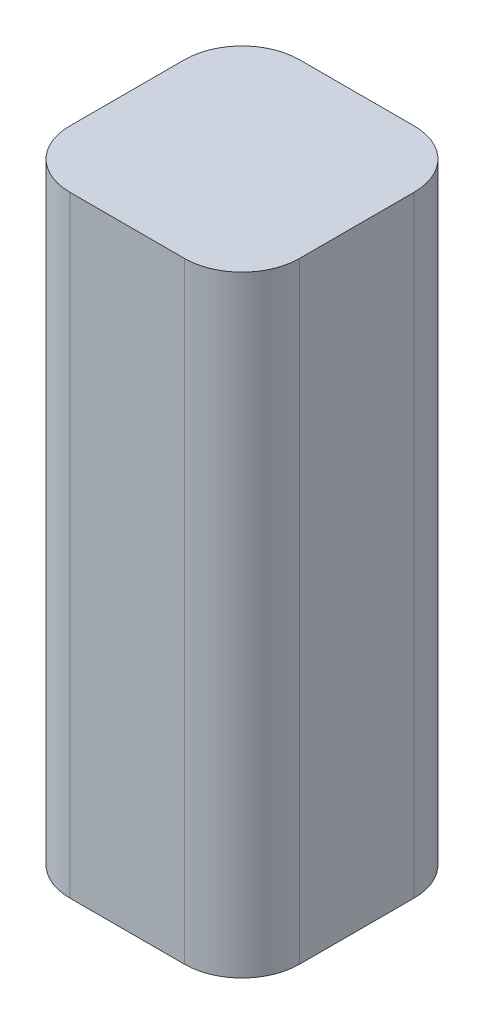
ISO-10303-21;
HEADER;
FILE_DESCRIPTION(('STEP AP214'),'2;1');
FILE_NAME('part.step','',(''),(''),'','','');
FILE_SCHEMA(('AUTOMOTIVE_DESIGN { 1 0 10303 214 1 1 1 1 }'));
ENDSEC;
DATA;
#1=APPLICATION_CONTEXT('core data for automotive mechanical design processes');
#2=APPLICATION_PROTOCOL_DEFINITION('international standard','automotive_design',2000,#1);
#3=PRODUCT_CONTEXT('',#1,'mechanical');
#4=PRODUCT('Part','Part','',(#3));
#5=PRODUCT_RELATED_PRODUCT_CATEGORY('part','',(#4));
#6=PRODUCT_DEFINITION_FORMATION('','',#4);
#7=PRODUCT_DEFINITION_CONTEXT('part definition',#1,'design');
#8=PRODUCT_DEFINITION('design','',#6,#7);
#9=PRODUCT_DEFINITION_SHAPE('','',#8);
#10=(LENGTH_UNIT() NAMED_UNIT(*) SI_UNIT(.MILLI.,.METRE.));
#11=(NAMED_UNIT(*) PLANE_ANGLE_UNIT() SI_UNIT($,.RADIAN.));
#12=(NAMED_UNIT(*) SI_UNIT($,.STERADIAN.) SOLID_ANGLE_UNIT());
#13=UNCERTAINTY_MEASURE_WITH_UNIT(LENGTH_MEASURE(1.E-05),#10,'distance_accuracy_value','');
#14=(GEOMETRIC_REPRESENTATION_CONTEXT(3) GLOBAL_UNCERTAINTY_ASSIGNED_CONTEXT((#13)) GLOBAL_UNIT_ASSIGNED_CONTEXT((#10,
#11,#12)) REPRESENTATION_CONTEXT('',''));
#15=CARTESIAN_POINT('',(0.,0.,0.));
#16=DIRECTION('',(0.,0.,1.));
#17=DIRECTION('',(1.,0.,0.));
#18=AXIS2_PLACEMENT_3D('',#15,#16,#17);
#19=CARTESIAN_POINT('',(0.,0.,0.));
#20=DIRECTION('',(0.,1.,0.));
#21=DIRECTION('',(0.,0.,1.));
#22=AXIS2_PLACEMENT_3D('',#19,#20,#21);
#23=PLANE('',#22);
#24=DIRECTION('',(-1.,0.,0.));
#25=VECTOR('',#24,1.);
#26=CARTESIAN_POINT('',(-4.,0.,-4.));
#27=LINE('',#26,#25);
#28=CARTESIAN_POINT('',(2.,0.,-4.));
#29=VERTEX_POINT('',#28);
#30=CARTESIAN_POINT('',(-2.,0.,-4.));
#31=VERTEX_POINT('',#30);
#32=EDGE_CURVE('E168',#29,#31,#27,.T.);
#33=ORIENTED_EDGE('',*,*,#32,.F.);
#34=CARTESIAN_POINT('',(2.,0.,-2.));
#35=DIRECTION('',(0.,1.,0.));
#36=DIRECTION('',(0.,0.,1.));
#37=AXIS2_PLACEMENT_3D('',#34,#35,#36);
#38=CIRCLE('',#37,2.);
#39=CARTESIAN_POINT('',(4.,0.,-2.));
#40=VERTEX_POINT('',#39);
#41=EDGE_CURVE('E194',#29,#40,#38,.F.);
#42=ORIENTED_EDGE('',*,*,#41,.T.);
#43=DIRECTION('',(0.,0.,-1.));
#44=VECTOR('',#43,1.);
#45=CARTESIAN_POINT('',(4.,0.,-4.));
#46=LINE('',#45,#44);
#47=CARTESIAN_POINT('',(4.,0.,2.));
#48=VERTEX_POINT('',#47);
#49=EDGE_CURVE('E165',#48,#40,#46,.T.);
#50=ORIENTED_EDGE('',*,*,#49,.F.);
#51=CARTESIAN_POINT('',(2.,0.,2.));
#52=DIRECTION('',(0.,1.,0.));
#53=DIRECTION('',(0.,0.,1.));
#54=AXIS2_PLACEMENT_3D('',#51,#52,#53);
#55=CIRCLE('',#54,2.);
#56=CARTESIAN_POINT('',(2.,0.,4.));
#57=VERTEX_POINT('',#56);
#58=EDGE_CURVE('E192',#48,#57,#55,.F.);
#59=ORIENTED_EDGE('',*,*,#58,.T.);
#60=DIRECTION('',(1.,0.,0.));
#61=VECTOR('',#60,1.);
#62=CARTESIAN_POINT('',(-4.,0.,4.));
#63=LINE('',#62,#61);
#64=CARTESIAN_POINT('',(-2.,0.,4.));
#65=VERTEX_POINT('',#64);
#66=EDGE_CURVE('E174',#65,#57,#63,.T.);
#67=ORIENTED_EDGE('',*,*,#66,.F.);
#68=CARTESIAN_POINT('',(-2.,0.,2.));
#69=DIRECTION('',(0.,1.,0.));
#70=DIRECTION('',(0.,0.,1.));
#71=AXIS2_PLACEMENT_3D('',#68,#69,#70);
#72=CIRCLE('',#71,2.);
#73=CARTESIAN_POINT('',(-4.,0.,2.));
#74=VERTEX_POINT('',#73);
#75=EDGE_CURVE('E188',#65,#74,#72,.F.);
#76=ORIENTED_EDGE('',*,*,#75,.T.);
#77=DIRECTION('',(0.,0.,1.));
#78=VECTOR('',#77,1.);
#79=CARTESIAN_POINT('',(-4.,0.,-4.));
#80=LINE('',#79,#78);
#81=CARTESIAN_POINT('',(-4.,0.,-2.));
#82=VERTEX_POINT('',#81);
#83=EDGE_CURVE('E171',#82,#74,#80,.T.);
#84=ORIENTED_EDGE('',*,*,#83,.F.);
#85=CARTESIAN_POINT('',(-2.,0.,-2.));
#86=DIRECTION('',(0.,1.,0.));
#87=DIRECTION('',(0.,0.,1.));
#88=AXIS2_PLACEMENT_3D('',#85,#86,#87);
#89=CIRCLE('',#88,2.);
#90=EDGE_CURVE('E190',#82,#31,#89,.F.);
#91=ORIENTED_EDGE('',*,*,#90,.T.);
#92=EDGE_LOOP('',(#33,#42,#50,#59,#67,#76,#84,#91));
#93=FACE_BOUND('',#92,.T.);
#94=CARTESIAN_POINT('',(0.,0.,0.));
#95=DIRECTION('',(0.,1.,0.));
#96=DIRECTION('',(0.,0.,1.));
#97=AXIS2_PLACEMENT_3D('',#94,#95,#96);
#98=CIRCLE('',#97,3.05);
#99=CARTESIAN_POINT('',(0.,0.,3.05));
#100=VERTEX_POINT('',#99);
#101=EDGE_CURVE('E162',#100,#100,#98,.T.);
#102=ORIENTED_EDGE('',*,*,#101,.T.);
#103=EDGE_LOOP('',(#102));
#104=FACE_BOUND('',#103,.T.);
#105=ADVANCED_FACE('F33',(#93,#104),#23,.F.);
#106=CARTESIAN_POINT('',(4.,8.8,-4.));
#107=DIRECTION('',(-1.,0.,0.));
#108=DIRECTION('',(0.,0.,1.));
#109=AXIS2_PLACEMENT_3D('',#106,#107,#108);
#110=PLANE('',#109);
#111=ORIENTED_EDGE('',*,*,#49,.T.);
#112=DIRECTION('',(0.,-1.,0.));
#113=VECTOR('',#112,1.);
#114=CARTESIAN_POINT('',(4.,8.8,-2.));
#115=LINE('',#114,#113);
#116=CARTESIAN_POINT('',(4.,21.3,-2.));
#117=VERTEX_POINT('',#116);
#118=EDGE_CURVE('E199',#40,#117,#115,.F.);
#119=ORIENTED_EDGE('',*,*,#118,.T.);
#120=DIRECTION('',(0.,0.,-1.));
#121=VECTOR('',#120,1.);
#122=CARTESIAN_POINT('',(4.,21.3,4.));
#123=LINE('',#122,#121);
#124=CARTESIAN_POINT('',(4.,21.3,2.));
#125=VERTEX_POINT('',#124);
#126=EDGE_CURVE('E239',#125,#117,#123,.T.);
#127=ORIENTED_EDGE('',*,*,#126,.F.);
#128=DIRECTION('',(0.,-1.,0.));
#129=VECTOR('',#128,1.);
#130=CARTESIAN_POINT('',(4.,8.8,2.));
#131=LINE('',#130,#129);
#132=EDGE_CURVE('E196',#125,#48,#131,.T.);
#133=ORIENTED_EDGE('',*,*,#132,.T.);
#134=EDGE_LOOP('',(#111,#119,#127,#133));
#135=FACE_BOUND('',#134,.T.);
#136=ADVANCED_FACE('F237',(#135),#110,.F.);
#137=CARTESIAN_POINT('',(-4.,8.8,-4.));
#138=DIRECTION('',(0.,0.,1.));
#139=DIRECTION('',(1.,0.,0.));
#140=AXIS2_PLACEMENT_3D('',#137,#138,#139);
#141=PLANE('',#140);
#142=DIRECTION('',(-1.,0.,0.));
#143=VECTOR('',#142,1.);
#144=CARTESIAN_POINT('',(-4.,21.3,-4.));
#145=LINE('',#144,#143);
#146=CARTESIAN_POINT('',(2.,21.3,-4.));
#147=VERTEX_POINT('',#146);
#148=CARTESIAN_POINT('',(-2.,21.3,-4.));
#149=VERTEX_POINT('',#148);
#150=EDGE_CURVE('E222',#147,#149,#145,.T.);
#151=ORIENTED_EDGE('',*,*,#150,.F.);
#152=DIRECTION('',(0.,-1.,0.));
#153=VECTOR('',#152,1.);
#154=CARTESIAN_POINT('',(2.,8.8,-4.));
#155=LINE('',#154,#153);
#156=EDGE_CURVE('E185',#147,#29,#155,.T.);
#157=ORIENTED_EDGE('',*,*,#156,.T.);
#158=ORIENTED_EDGE('',*,*,#32,.T.);
#159=DIRECTION('',(0.,-1.,0.));
#160=VECTOR('',#159,1.);
#161=CARTESIAN_POINT('',(-2.,8.8,-4.));
#162=LINE('',#161,#160);
#163=EDGE_CURVE('E183',#31,#149,#162,.F.);
#164=ORIENTED_EDGE('',*,*,#163,.T.);
#165=EDGE_LOOP('',(#151,#157,#158,#164));
#166=FACE_BOUND('',#165,.T.);
#167=ADVANCED_FACE('F278',(#166),#141,.F.);
#168=CARTESIAN_POINT('',(-4.,8.8,-4.));
#169=DIRECTION('',(1.,0.,0.));
#170=DIRECTION('',(0.,0.,-1.));
#171=AXIS2_PLACEMENT_3D('',#168,#169,#170);
#172=PLANE('',#171);
#173=DIRECTION('',(0.,0.,1.));
#174=VECTOR('',#173,1.);
#175=CARTESIAN_POINT('',(-4.,12.,1.30742598904123));
#176=LINE('',#175,#174);
#177=CARTESIAN_POINT('',(-4.,12.,-1.30742598904123));
#178=VERTEX_POINT('',#177);
#179=CARTESIAN_POINT('',(-4.,12.,1.30742598904123));
#180=VERTEX_POINT('',#179);
#181=EDGE_CURVE('E140',#178,#180,#176,.T.);
#182=ORIENTED_EDGE('',*,*,#181,.F.);
#183=DIRECTION('',(0.,-1.,0.));
#184=VECTOR('',#183,1.);
#185=CARTESIAN_POINT('',(-4.,12.,-1.30742598904123));
#186=LINE('',#185,#184);
#187=CARTESIAN_POINT('',(-4.,12.8,-1.30742598904123));
#188=VERTEX_POINT('',#187);
#189=EDGE_CURVE('E145',#188,#178,#186,.T.);
#190=ORIENTED_EDGE('',*,*,#189,.F.);
#191=DIRECTION('',(0.,0.,-1.));
#192=VECTOR('',#191,1.);
#193=CARTESIAN_POINT('',(-4.,12.8,1.30742598904123));
#194=LINE('',#193,#192);
#195=CARTESIAN_POINT('',(-4.,12.8,1.30742598904123));
#196=VERTEX_POINT('',#195);
#197=EDGE_CURVE('E150',#196,#188,#194,.T.);
#198=ORIENTED_EDGE('',*,*,#197,.F.);
#199=DIRECTION('',(0.,1.,0.));
#200=VECTOR('',#199,1.);
#201=CARTESIAN_POINT('',(-4.,12.,1.30742598904123));
#202=LINE('',#201,#200);
#203=EDGE_CURVE('E129',#180,#196,#202,.T.);
#204=ORIENTED_EDGE('',*,*,#203,.F.);
#205=EDGE_LOOP('',(#182,#190,#198,#204));
#206=FACE_BOUND('',#205,.T.);
#207=DIRECTION('',(0.,0.,1.));
#208=VECTOR('',#207,1.);
#209=CARTESIAN_POINT('',(-4.,21.3,4.));
#210=LINE('',#209,#208);
#211=CARTESIAN_POINT('',(-4.,21.3,-2.));
#212=VERTEX_POINT('',#211);
#213=CARTESIAN_POINT('',(-4.,21.3,2.));
#214=VERTEX_POINT('',#213);
#215=EDGE_CURVE('E213',#212,#214,#210,.T.);
#216=ORIENTED_EDGE('',*,*,#215,.F.);
#217=DIRECTION('',(0.,-1.,0.));
#218=VECTOR('',#217,1.);
#219=CARTESIAN_POINT('',(-4.,8.8,-2.));
#220=LINE('',#219,#218);
#221=EDGE_CURVE('E11',#212,#82,#220,.T.);
#222=ORIENTED_EDGE('',*,*,#221,.T.);
#223=ORIENTED_EDGE('',*,*,#83,.T.);
#224=DIRECTION('',(0.,-1.,0.));
#225=VECTOR('',#224,1.);
#226=CARTESIAN_POINT('',(-4.,8.8,2.));
#227=LINE('',#226,#225);
#228=EDGE_CURVE('E41',#74,#214,#227,.F.);
#229=ORIENTED_EDGE('',*,*,#228,.T.);
#230=EDGE_LOOP('',(#216,#222,#223,#229));
#231=FACE_BOUND('',#230,.T.);
#232=ADVANCED_FACE('F147',(#206,#231),#172,.F.);
#233=CARTESIAN_POINT('',(-4.,8.8,4.));
#234=DIRECTION('',(0.,0.,-1.));
#235=DIRECTION('',(-1.,0.,0.));
#236=AXIS2_PLACEMENT_3D('',#233,#234,#235);
#237=PLANE('',#236);
#238=ORIENTED_EDGE('',*,*,#66,.T.);
#239=DIRECTION('',(0.,-1.,0.));
#240=VECTOR('',#239,1.);
#241=CARTESIAN_POINT('',(2.,8.8,4.));
#242=LINE('',#241,#240);
#243=CARTESIAN_POINT('',(2.,21.3,4.));
#244=VERTEX_POINT('',#243);
#245=EDGE_CURVE('E48',#57,#244,#242,.F.);
#246=ORIENTED_EDGE('',*,*,#245,.T.);
#247=DIRECTION('',(1.,0.,0.));
#248=VECTOR('',#247,1.);
#249=CARTESIAN_POINT('',(-4.,21.3,4.));
#250=LINE('',#249,#248);
#251=CARTESIAN_POINT('',(-2.,21.3,4.));
#252=VERTEX_POINT('',#251);
#253=EDGE_CURVE('E221',#252,#244,#250,.T.);
#254=ORIENTED_EDGE('',*,*,#253,.F.);
#255=DIRECTION('',(0.,-1.,0.));
#256=VECTOR('',#255,1.);
#257=CARTESIAN_POINT('',(-2.,8.8,4.));
#258=LINE('',#257,#256);
#259=EDGE_CURVE('E208',#252,#65,#258,.T.);
#260=ORIENTED_EDGE('',*,*,#259,.T.);
#261=EDGE_LOOP('',(#238,#246,#254,#260));
#262=FACE_BOUND('',#261,.T.);
#263=ADVANCED_FACE('F226',(#262),#237,.F.);
#264=CARTESIAN_POINT('',(0.,8.8,0.));
#265=DIRECTION('',(0.,-1.,0.));
#266=DIRECTION('',(0.,0.,-1.));
#267=AXIS2_PLACEMENT_3D('',#264,#265,#266);
#268=CYLINDRICAL_SURFACE('',#267,3.05);
#269=DIRECTION('',(0.,-1.,0.));
#270=VECTOR('',#269,1.);
#271=CARTESIAN_POINT('',(-2.75556478479087,8.8,-1.30742598904123));
#272=LINE('',#271,#270);
#273=CARTESIAN_POINT('',(-2.75556478479087,12.,-1.30742598904123));
#274=VERTEX_POINT('',#273);
#275=CARTESIAN_POINT('',(-2.75556478479087,12.8,-1.30742598904123));
#276=VERTEX_POINT('',#275);
#277=EDGE_CURVE('E181',#274,#276,#272,.F.);
#278=ORIENTED_EDGE('',*,*,#277,.F.);
#279=CARTESIAN_POINT('',(0.,12.,0.));
#280=DIRECTION('',(0.,-1.,0.));
#281=DIRECTION('',(0.,0.,-1.));
#282=AXIS2_PLACEMENT_3D('',#279,#280,#281);
#283=CIRCLE('',#282,3.05);
#284=CARTESIAN_POINT('',(-2.75556478479087,12.,1.30742598904123));
#285=VERTEX_POINT('',#284);
#286=EDGE_CURVE('E176',#285,#274,#283,.T.);
#287=ORIENTED_EDGE('',*,*,#286,.F.);
#288=DIRECTION('',(0.,-1.,0.));
#289=VECTOR('',#288,1.);
#290=CARTESIAN_POINT('',(-2.75556478479087,8.8,1.30742598904123));
#291=LINE('',#290,#289);
#292=CARTESIAN_POINT('',(-2.75556478479087,12.8,1.30742598904123));
#293=VERTEX_POINT('',#292);
#294=EDGE_CURVE('E132',#293,#285,#291,.T.);
#295=ORIENTED_EDGE('',*,*,#294,.F.);
#296=CARTESIAN_POINT('',(0.,12.8,0.));
#297=DIRECTION('',(0.,1.,0.));
#298=DIRECTION('',(0.,0.,1.));
#299=AXIS2_PLACEMENT_3D('',#296,#297,#298);
#300=CIRCLE('',#299,3.05);
#301=EDGE_CURVE('E179',#276,#293,#300,.T.);
#302=ORIENTED_EDGE('',*,*,#301,.F.);
#303=EDGE_LOOP('',(#278,#287,#295,#302));
#304=FACE_BOUND('',#303,.T.);
#305=ORIENTED_EDGE('',*,*,#101,.F.);
#306=EDGE_LOOP('',(#305));
#307=FACE_BOUND('',#306,.T.);
#308=CARTESIAN_POINT('',(0.,13.3,0.));
#309=DIRECTION('',(0.,-1.,0.));
#310=DIRECTION('',(0.,0.,-1.));
#311=AXIS2_PLACEMENT_3D('',#308,#309,#310);
#312=CIRCLE('',#311,3.05);
#313=CARTESIAN_POINT('',(0.,13.3,-3.05));
#314=VERTEX_POINT('',#313);
#315=EDGE_CURVE('E157',#314,#314,#312,.T.);
#316=ORIENTED_EDGE('',*,*,#315,.F.);
#317=EDGE_LOOP('',(#316));
#318=FACE_BOUND('',#317,.T.);
#319=ADVANCED_FACE('F252',(#304,#307,#318),#268,.F.);
#320=CARTESIAN_POINT('',(2.,12.,-1.30742598904123));
#321=DIRECTION('',(0.,0.,-1.));
#322=DIRECTION('',(-1.,0.,0.));
#323=AXIS2_PLACEMENT_3D('',#320,#321,#322);
#324=PLANE('',#323);
#325=ORIENTED_EDGE('',*,*,#277,.T.);
#326=DIRECTION('',(-1.,0.,0.));
#327=VECTOR('',#326,1.);
#328=CARTESIAN_POINT('',(2.,12.8,-1.30742598904123));
#329=LINE('',#328,#327);
#330=EDGE_CURVE('E155',#276,#188,#329,.T.);
#331=ORIENTED_EDGE('',*,*,#330,.T.);
#332=ORIENTED_EDGE('',*,*,#189,.T.);
#333=DIRECTION('',(-1.,0.,0.));
#334=VECTOR('',#333,1.);
#335=CARTESIAN_POINT('',(2.,12.,-1.30742598904123));
#336=LINE('',#335,#334);
#337=EDGE_CURVE('E136',#274,#178,#336,.T.);
#338=ORIENTED_EDGE('',*,*,#337,.F.);
#339=EDGE_LOOP('',(#325,#331,#332,#338));
#340=FACE_BOUND('',#339,.T.);
#341=ADVANCED_FACE('F245',(#340),#324,.F.);
#342=CARTESIAN_POINT('',(2.,12.8,1.30742598904123));
#343=DIRECTION('',(0.,1.,0.));
#344=DIRECTION('',(0.,0.,1.));
#345=AXIS2_PLACEMENT_3D('',#342,#343,#344);
#346=PLANE('',#345);
#347=ORIENTED_EDGE('',*,*,#301,.T.);
#348=DIRECTION('',(-1.,0.,0.));
#349=VECTOR('',#348,1.);
#350=CARTESIAN_POINT('',(2.,12.8,1.30742598904123));
#351=LINE('',#350,#349);
#352=EDGE_CURVE('E135',#293,#196,#351,.T.);
#353=ORIENTED_EDGE('',*,*,#352,.T.);
#354=ORIENTED_EDGE('',*,*,#197,.T.);
#355=ORIENTED_EDGE('',*,*,#330,.F.);
#356=EDGE_LOOP('',(#347,#353,#354,#355));
#357=FACE_BOUND('',#356,.T.);
#358=ADVANCED_FACE('F250',(#357),#346,.F.);
#359=CARTESIAN_POINT('',(2.,12.,1.30742598904123));
#360=DIRECTION('',(0.,0.,1.));
#361=DIRECTION('',(0.,-1.,0.));
#362=AXIS2_PLACEMENT_3D('',#359,#360,#361);
#363=PLANE('',#362);
#364=ORIENTED_EDGE('',*,*,#294,.T.);
#365=DIRECTION('',(-1.,0.,0.));
#366=VECTOR('',#365,1.);
#367=CARTESIAN_POINT('',(2.,12.,1.30742598904123));
#368=LINE('',#367,#366);
#369=EDGE_CURVE('E124',#285,#180,#368,.T.);
#370=ORIENTED_EDGE('',*,*,#369,.T.);
#371=ORIENTED_EDGE('',*,*,#203,.T.);
#372=ORIENTED_EDGE('',*,*,#352,.F.);
#373=EDGE_LOOP('',(#364,#370,#371,#372));
#374=FACE_BOUND('',#373,.T.);
#375=ADVANCED_FACE('F126',(#374),#363,.F.);
#376=CARTESIAN_POINT('',(2.,12.,1.30742598904123));
#377=DIRECTION('',(0.,-1.,0.));
#378=DIRECTION('',(0.,0.,-1.));
#379=AXIS2_PLACEMENT_3D('',#376,#377,#378);
#380=PLANE('',#379);
#381=ORIENTED_EDGE('',*,*,#286,.T.);
#382=ORIENTED_EDGE('',*,*,#337,.T.);
#383=ORIENTED_EDGE('',*,*,#181,.T.);
#384=ORIENTED_EDGE('',*,*,#369,.F.);
#385=EDGE_LOOP('',(#381,#382,#383,#384));
#386=FACE_BOUND('',#385,.T.);
#387=ADVANCED_FACE('F141',(#386),#380,.F.);
#388=CARTESIAN_POINT('',(0.,21.3,0.));
#389=DIRECTION('',(0.,-1.,0.));
#390=DIRECTION('',(0.,0.,-1.));
#391=AXIS2_PLACEMENT_3D('',#388,#389,#390);
#392=PLANE('',#391);
#393=ORIENTED_EDGE('',*,*,#126,.T.);
#394=CARTESIAN_POINT('',(2.,21.3,-2.));
#395=DIRECTION('',(0.,-1.,0.));
#396=DIRECTION('',(0.,0.,-1.));
#397=AXIS2_PLACEMENT_3D('',#394,#395,#396);
#398=CIRCLE('',#397,2.);
#399=EDGE_CURVE('E206',#117,#147,#398,.F.);
#400=ORIENTED_EDGE('',*,*,#399,.T.);
#401=ORIENTED_EDGE('',*,*,#150,.T.);
#402=CARTESIAN_POINT('',(-2.,21.3,-2.));
#403=DIRECTION('',(0.,-1.,0.));
#404=DIRECTION('',(0.,0.,-1.));
#405=AXIS2_PLACEMENT_3D('',#402,#403,#404);
#406=CIRCLE('',#405,2.);
#407=EDGE_CURVE('E202',#149,#212,#406,.F.);
#408=ORIENTED_EDGE('',*,*,#407,.T.);
#409=ORIENTED_EDGE('',*,*,#215,.T.);
#410=CARTESIAN_POINT('',(-2.,21.3,2.));
#411=DIRECTION('',(0.,-1.,0.));
#412=DIRECTION('',(0.,0.,-1.));
#413=AXIS2_PLACEMENT_3D('',#410,#411,#412);
#414=CIRCLE('',#413,2.);
#415=EDGE_CURVE('E55',#214,#252,#414,.F.);
#416=ORIENTED_EDGE('',*,*,#415,.T.);
#417=ORIENTED_EDGE('',*,*,#253,.T.);
#418=CARTESIAN_POINT('',(2.,21.3,2.));
#419=DIRECTION('',(0.,-1.,0.));
#420=DIRECTION('',(0.,0.,-1.));
#421=AXIS2_PLACEMENT_3D('',#418,#419,#420);
#422=CIRCLE('',#421,2.);
#423=EDGE_CURVE('E204',#244,#125,#422,.F.);
#424=ORIENTED_EDGE('',*,*,#423,.T.);
#425=EDGE_LOOP('',(#393,#400,#401,#408,#409,#416,#417,#424));
#426=FACE_BOUND('',#425,.T.);
#427=ADVANCED_FACE('F218',(#426),#392,.F.);
#428=CARTESIAN_POINT('',(0.,13.3,0.));
#429=DIRECTION('',(0.,-1.,0.));
#430=DIRECTION('',(0.,0.,-1.));
#431=AXIS2_PLACEMENT_3D('',#428,#429,#430);
#432=PLANE('',#431);
#433=ORIENTED_EDGE('',*,*,#315,.T.);
#434=EDGE_LOOP('',(#433));
#435=FACE_BOUND('',#434,.T.);
#436=ADVANCED_FACE('F260',(#435),#432,.T.);
#437=CARTESIAN_POINT('',(2.,8.8,-2.));
#438=DIRECTION('',(0.,-1.,0.));
#439=DIRECTION('',(0.,0.,-1.));
#440=AXIS2_PLACEMENT_3D('',#437,#438,#439);
#441=CYLINDRICAL_SURFACE('',#440,2.);
#442=ORIENTED_EDGE('',*,*,#399,.F.);
#443=ORIENTED_EDGE('',*,*,#118,.F.);
#444=ORIENTED_EDGE('',*,*,#41,.F.);
#445=ORIENTED_EDGE('',*,*,#156,.F.);
#446=EDGE_LOOP('',(#442,#443,#444,#445));
#447=FACE_BOUND('',#446,.T.);
#448=ADVANCED_FACE('F262',(#447),#441,.T.);
#449=CARTESIAN_POINT('',(2.,8.8,2.));
#450=DIRECTION('',(0.,-1.,0.));
#451=DIRECTION('',(0.,0.,-1.));
#452=AXIS2_PLACEMENT_3D('',#449,#450,#451);
#453=CYLINDRICAL_SURFACE('',#452,2.);
#454=ORIENTED_EDGE('',*,*,#423,.F.);
#455=ORIENTED_EDGE('',*,*,#245,.F.);
#456=ORIENTED_EDGE('',*,*,#58,.F.);
#457=ORIENTED_EDGE('',*,*,#132,.F.);
#458=EDGE_LOOP('',(#454,#455,#456,#457));
#459=FACE_BOUND('',#458,.T.);
#460=ADVANCED_FACE('F234',(#459),#453,.T.);
#461=CARTESIAN_POINT('',(-2.,8.8,-2.));
#462=DIRECTION('',(0.,-1.,0.));
#463=DIRECTION('',(0.,0.,-1.));
#464=AXIS2_PLACEMENT_3D('',#461,#462,#463);
#465=CYLINDRICAL_SURFACE('',#464,2.);
#466=ORIENTED_EDGE('',*,*,#407,.F.);
#467=ORIENTED_EDGE('',*,*,#163,.F.);
#468=ORIENTED_EDGE('',*,*,#90,.F.);
#469=ORIENTED_EDGE('',*,*,#221,.F.);
#470=EDGE_LOOP('',(#466,#467,#468,#469));
#471=FACE_BOUND('',#470,.T.);
#472=ADVANCED_FACE('F290',(#471),#465,.T.);
#473=CARTESIAN_POINT('',(-2.,8.8,2.));
#474=DIRECTION('',(0.,-1.,0.));
#475=DIRECTION('',(0.,0.,-1.));
#476=AXIS2_PLACEMENT_3D('',#473,#474,#475);
#477=CYLINDRICAL_SURFACE('',#476,2.);
#478=ORIENTED_EDGE('',*,*,#415,.F.);
#479=ORIENTED_EDGE('',*,*,#228,.F.);
#480=ORIENTED_EDGE('',*,*,#75,.F.);
#481=ORIENTED_EDGE('',*,*,#259,.F.);
#482=EDGE_LOOP('',(#478,#479,#480,#481));
#483=FACE_BOUND('',#482,.T.);
#484=ADVANCED_FACE('F35',(#483),#477,.T.);
#485=CLOSED_SHELL('',(#105,#136,#167,#232,#263,#319,#341,#358,#375,#387,#427,#436,#448,#460,
#472,#484));
#486=MANIFOLD_SOLID_BREP('B2',#485);
#487=ADVANCED_BREP_SHAPE_REPRESENTATION('',(#18,#486),#14);
#488=SHAPE_DEFINITION_REPRESENTATION(#9,#487);
ENDSEC;
END-ISO-10303-21;
